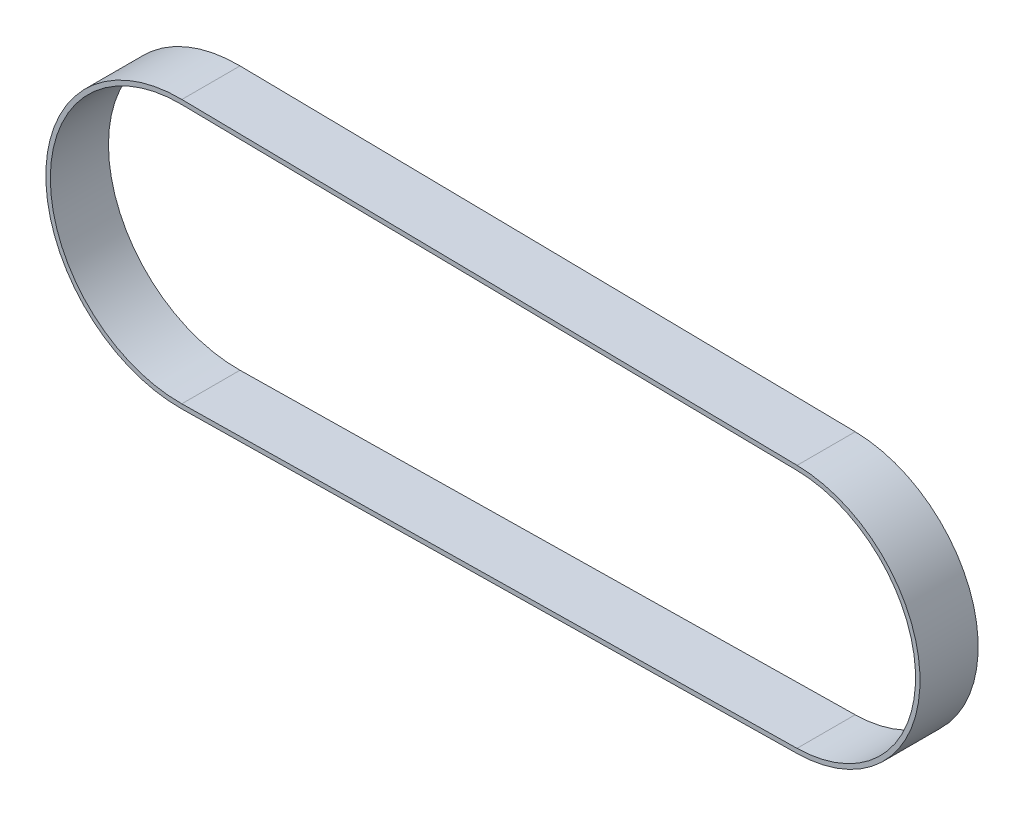
ISO-10303-21;
HEADER;
FILE_DESCRIPTION(('STEP AP214'),'2;1');
FILE_NAME('part.step','',(''),(''),'','','');
FILE_SCHEMA(('AUTOMOTIVE_DESIGN { 1 0 10303 214 1 1 1 1 }'));
ENDSEC;
DATA;
#1=APPLICATION_CONTEXT('core data for automotive mechanical design processes');
#2=APPLICATION_PROTOCOL_DEFINITION('international standard','automotive_design',2000,#1);
#3=PRODUCT_CONTEXT('',#1,'mechanical');
#4=PRODUCT('Part','Part','',(#3));
#5=PRODUCT_RELATED_PRODUCT_CATEGORY('part','',(#4));
#6=PRODUCT_DEFINITION_FORMATION('','',#4);
#7=PRODUCT_DEFINITION_CONTEXT('part definition',#1,'design');
#8=PRODUCT_DEFINITION('design','',#6,#7);
#9=PRODUCT_DEFINITION_SHAPE('','',#8);
#10=(LENGTH_UNIT() NAMED_UNIT(*) SI_UNIT(.MILLI.,.METRE.));
#11=(NAMED_UNIT(*) PLANE_ANGLE_UNIT() SI_UNIT($,.RADIAN.));
#12=(NAMED_UNIT(*) SI_UNIT($,.STERADIAN.) SOLID_ANGLE_UNIT());
#13=UNCERTAINTY_MEASURE_WITH_UNIT(LENGTH_MEASURE(1.E-05),#10,'distance_accuracy_value','');
#14=(GEOMETRIC_REPRESENTATION_CONTEXT(3) GLOBAL_UNCERTAINTY_ASSIGNED_CONTEXT((#13)) GLOBAL_UNIT_ASSIGNED_CONTEXT((#10,
#11,#12)) REPRESENTATION_CONTEXT('',''));
#15=CARTESIAN_POINT('',(0.,0.,0.));
#16=DIRECTION('',(0.,0.,1.));
#17=DIRECTION('',(1.,0.,0.));
#18=AXIS2_PLACEMENT_3D('',#15,#16,#17);
#19=CARTESIAN_POINT('',(-158.727259161453,0.,15.));
#20=DIRECTION('',(0.,0.,-1.));
#21=DIRECTION('',(-1.,0.,0.));
#22=AXIS2_PLACEMENT_3D('',#19,#20,#21);
#23=CYLINDRICAL_SURFACE('',#22,34.578163);
#24=CARTESIAN_POINT('',(-158.727259161453,0.,0.));
#25=DIRECTION('',(0.,0.,-1.));
#26=DIRECTION('',(-1.,0.,0.));
#27=AXIS2_PLACEMENT_3D('',#24,#25,#26);
#28=CIRCLE('',#27,34.578163);
#29=CARTESIAN_POINT('',(-158.207986742925,34.5742637320005,0.));
#30=VERTEX_POINT('',#29);
#31=CARTESIAN_POINT('',(-158.207986742925,-34.5742637320005,0.));
#32=VERTEX_POINT('',#31);
#33=EDGE_CURVE('E102',#30,#32,#28,.F.);
#34=ORIENTED_EDGE('',*,*,#33,.T.);
#35=DIRECTION('',(0.,0.,1.));
#36=VECTOR('',#35,1.);
#37=CARTESIAN_POINT('',(-158.207986742925,-34.5742637320005,15.));
#38=LINE('',#37,#36);
#39=CARTESIAN_POINT('',(-158.207986742925,-34.5742637320005,15.));
#40=VERTEX_POINT('',#39);
#41=EDGE_CURVE('E117',#32,#40,#38,.T.);
#42=ORIENTED_EDGE('',*,*,#41,.T.);
#43=CARTESIAN_POINT('',(-158.727259161453,0.,15.));
#44=DIRECTION('',(0.,0.,-1.));
#45=DIRECTION('',(-1.,0.,0.));
#46=AXIS2_PLACEMENT_3D('',#43,#44,#45);
#47=CIRCLE('',#46,34.578163);
#48=CARTESIAN_POINT('',(-158.207986742925,34.5742637320005,15.));
#49=VERTEX_POINT('',#48);
#50=EDGE_CURVE('E130',#49,#40,#47,.F.);
#51=ORIENTED_EDGE('',*,*,#50,.F.);
#52=DIRECTION('',(0.,0.,1.));
#53=VECTOR('',#52,1.);
#54=CARTESIAN_POINT('',(-158.207986742925,34.5742637320005,15.));
#55=LINE('',#54,#53);
#56=EDGE_CURVE('E98',#49,#30,#55,.F.);
#57=ORIENTED_EDGE('',*,*,#56,.T.);
#58=EDGE_LOOP('',(#34,#42,#51,#57));
#59=FACE_BOUND('',#58,.T.);
#60=ADVANCED_FACE('F17',(#59),#23,.T.);
#61=CARTESIAN_POINT('',(-158.207986742925,-34.5742637320005,15.));
#62=DIRECTION('',(-0.0150173512262025,0.999887233222902,0.));
#63=DIRECTION('',(-0.999887233222902,-0.0150173512262025,0.));
#64=AXIS2_PLACEMENT_3D('',#61,#62,#63);
#65=PLANE('',#64);
#66=DIRECTION('',(0.,0.,-1.));
#67=VECTOR('',#66,1.);
#68=CARTESIAN_POINT('',(0.483476114051973,-32.1908695299947,15.));
#69=LINE('',#68,#67);
#70=CARTESIAN_POINT('',(0.483476114051963,-32.1908695299947,15.));
#71=VERTEX_POINT('',#70);
#72=CARTESIAN_POINT('',(0.483476114051976,-32.1908695299947,0.));
#73=VERTEX_POINT('',#72);
#74=EDGE_CURVE('E84',#71,#73,#69,.T.);
#75=ORIENTED_EDGE('',*,*,#74,.F.);
#76=DIRECTION('',(0.999887233222901,0.0150173512262026,0.));
#77=VECTOR('',#76,1.);
#78=CARTESIAN_POINT('',(-158.207986742925,-34.5742637320005,15.));
#79=LINE('',#78,#77);
#80=EDGE_CURVE('E129',#40,#71,#79,.T.);
#81=ORIENTED_EDGE('',*,*,#80,.F.);
#82=ORIENTED_EDGE('',*,*,#41,.F.);
#83=DIRECTION('',(0.999887233222901,0.0150173512262026,0.));
#84=VECTOR('',#83,1.);
#85=CARTESIAN_POINT('',(-158.207986742925,-34.5742637320005,0.));
#86=LINE('',#85,#84);
#87=EDGE_CURVE('E89',#32,#73,#86,.T.);
#88=ORIENTED_EDGE('',*,*,#87,.T.);
#89=EDGE_LOOP('',(#75,#81,#82,#88));
#90=FACE_BOUND('',#89,.T.);
#91=ADVANCED_FACE('F180',(#90),#65,.F.);
#92=CARTESIAN_POINT('',(0.,0.,15.));
#93=DIRECTION('',(0.,0.,-1.));
#94=DIRECTION('',(-1.,0.,0.));
#95=AXIS2_PLACEMENT_3D('',#92,#93,#94);
#96=CYLINDRICAL_SURFACE('',#95,32.1945);
#97=CARTESIAN_POINT('',(0.,0.,15.));
#98=DIRECTION('',(0.,0.,-1.));
#99=DIRECTION('',(-1.,0.,0.));
#100=AXIS2_PLACEMENT_3D('',#97,#98,#99);
#101=CIRCLE('',#100,32.1945);
#102=CARTESIAN_POINT('',(0.483476114052001,32.1908695299947,15.));
#103=VERTEX_POINT('',#102);
#104=EDGE_CURVE('E127',#71,#103,#101,.F.);
#105=ORIENTED_EDGE('',*,*,#104,.F.);
#106=ORIENTED_EDGE('',*,*,#74,.T.);
#107=CARTESIAN_POINT('',(0.,0.,0.));
#108=DIRECTION('',(0.,0.,-1.));
#109=DIRECTION('',(-1.,0.,0.));
#110=AXIS2_PLACEMENT_3D('',#107,#108,#109);
#111=CIRCLE('',#110,32.1945);
#112=CARTESIAN_POINT('',(0.483476114052001,32.1908695299947,0.));
#113=VERTEX_POINT('',#112);
#114=EDGE_CURVE('E20',#73,#113,#111,.F.);
#115=ORIENTED_EDGE('',*,*,#114,.T.);
#116=DIRECTION('',(0.,0.,1.));
#117=VECTOR('',#116,1.);
#118=CARTESIAN_POINT('',(0.483476114052028,32.1908695299947,15.));
#119=LINE('',#118,#117);
#120=EDGE_CURVE('E82',#113,#103,#119,.T.);
#121=ORIENTED_EDGE('',*,*,#120,.T.);
#122=EDGE_LOOP('',(#105,#106,#115,#121));
#123=FACE_BOUND('',#122,.T.);
#124=ADVANCED_FACE('F81',(#123),#96,.T.);
#125=CARTESIAN_POINT('',(-158.207986742925,34.5742637320005,15.));
#126=DIRECTION('',(-0.0150173512262024,-0.999887233222902,0.));
#127=DIRECTION('',(0.999887233222902,-0.0150173512262024,0.));
#128=AXIS2_PLACEMENT_3D('',#125,#126,#127);
#129=PLANE('',#128);
#130=ORIENTED_EDGE('',*,*,#56,.F.);
#131=DIRECTION('',(-0.999887233222901,0.0150173512262024,0.));
#132=VECTOR('',#131,1.);
#133=CARTESIAN_POINT('',(0.483476114052001,32.1908695299947,15.));
#134=LINE('',#133,#132);
#135=EDGE_CURVE('E96',#103,#49,#134,.T.);
#136=ORIENTED_EDGE('',*,*,#135,.F.);
#137=ORIENTED_EDGE('',*,*,#120,.F.);
#138=DIRECTION('',(-0.999887233222901,0.0150173512262024,0.));
#139=VECTOR('',#138,1.);
#140=CARTESIAN_POINT('',(0.483476114052001,32.1908695299947,0.));
#141=LINE('',#140,#139);
#142=EDGE_CURVE('E88',#113,#30,#141,.T.);
#143=ORIENTED_EDGE('',*,*,#142,.T.);
#144=EDGE_LOOP('',(#130,#136,#137,#143));
#145=FACE_BOUND('',#144,.T.);
#146=ADVANCED_FACE('F93',(#145),#129,.F.);
#147=CARTESIAN_POINT('',(-158.225342295738,-33.4186940565648,15.));
#148=DIRECTION('',(-0.0150173512262025,0.999887233222902,0.));
#149=DIRECTION('',(-0.999887233222902,-0.0150173512262025,0.));
#150=AXIS2_PLACEMENT_3D('',#147,#148,#149);
#151=PLANE('',#150);
#152=DIRECTION('',(-0.999887233222901,-0.0150173512262025,0.));
#153=VECTOR('',#152,1.);
#154=CARTESIAN_POINT('',(0.466120561239847,-31.035299854559,15.));
#155=LINE('',#154,#153);
#156=CARTESIAN_POINT('',(0.466120561239853,-31.035299854559,15.));
#157=VERTEX_POINT('',#156);
#158=CARTESIAN_POINT('',(-158.225342295738,-33.4186940565648,15.));
#159=VERTEX_POINT('',#158);
#160=EDGE_CURVE('E123',#157,#159,#155,.T.);
#161=ORIENTED_EDGE('',*,*,#160,.F.);
#162=DIRECTION('',(0.,0.,-1.));
#163=VECTOR('',#162,1.);
#164=CARTESIAN_POINT('',(0.466120561239851,-31.035299854559,15.));
#165=LINE('',#164,#163);
#166=CARTESIAN_POINT('',(0.466120561239853,-31.035299854559,0.));
#167=VERTEX_POINT('',#166);
#168=EDGE_CURVE('E112',#157,#167,#165,.T.);
#169=ORIENTED_EDGE('',*,*,#168,.T.);
#170=DIRECTION('',(-0.999887233222901,-0.0150173512262025,0.));
#171=VECTOR('',#170,1.);
#172=CARTESIAN_POINT('',(0.466120561239847,-31.035299854559,0.));
#173=LINE('',#172,#171);
#174=CARTESIAN_POINT('',(-158.225342295738,-33.4186940565648,0.));
#175=VERTEX_POINT('',#174);
#176=EDGE_CURVE('E104',#167,#175,#173,.T.);
#177=ORIENTED_EDGE('',*,*,#176,.T.);
#178=DIRECTION('',(0.,0.,-1.));
#179=VECTOR('',#178,1.);
#180=CARTESIAN_POINT('',(-158.225342295738,-33.4186940565648,15.));
#181=LINE('',#180,#179);
#182=EDGE_CURVE('E109',#175,#159,#181,.F.);
#183=ORIENTED_EDGE('',*,*,#182,.T.);
#184=EDGE_LOOP('',(#161,#169,#177,#183));
#185=FACE_BOUND('',#184,.T.);
#186=ADVANCED_FACE('F157',(#185),#151,.T.);
#187=CARTESIAN_POINT('',(-158.727259161453,0.,0.));
#188=DIRECTION('',(0.,0.,1.));
#189=DIRECTION('',(1.,0.,0.));
#190=AXIS2_PLACEMENT_3D('',#187,#188,#189);
#191=PLANE('',#190);
#192=DIRECTION('',(0.999887233222902,-0.0150173512262024,0.));
#193=VECTOR('',#192,1.);
#194=CARTESIAN_POINT('',(-158.225342295738,33.4186940565648,0.));
#195=LINE('',#194,#193);
#196=CARTESIAN_POINT('',(-158.225342295738,33.4186940565648,0.));
#197=VERTEX_POINT('',#196);
#198=CARTESIAN_POINT('',(0.46612056123987,31.035299854559,0.));
#199=VERTEX_POINT('',#198);
#200=EDGE_CURVE('E120',#197,#199,#195,.T.);
#201=ORIENTED_EDGE('',*,*,#200,.F.);
#202=CARTESIAN_POINT('',(-158.727259161453,0.,0.));
#203=DIRECTION('',(0.,0.,-1.));
#204=DIRECTION('',(-1.,0.,0.));
#205=AXIS2_PLACEMENT_3D('',#202,#203,#204);
#206=CIRCLE('',#205,33.422463);
#207=EDGE_CURVE('E121',#197,#175,#206,.F.);
#208=ORIENTED_EDGE('',*,*,#207,.T.);
#209=ORIENTED_EDGE('',*,*,#176,.F.);
#210=CARTESIAN_POINT('',(0.,0.,0.));
#211=DIRECTION('',(0.,0.,-1.));
#212=DIRECTION('',(-1.,0.,0.));
#213=AXIS2_PLACEMENT_3D('',#210,#211,#212);
#214=CIRCLE('',#213,31.0388);
#215=EDGE_CURVE('E113',#167,#199,#214,.F.);
#216=ORIENTED_EDGE('',*,*,#215,.T.);
#217=EDGE_LOOP('',(#201,#208,#209,#216));
#218=FACE_BOUND('',#217,.T.);
#219=ORIENTED_EDGE('',*,*,#142,.F.);
#220=ORIENTED_EDGE('',*,*,#114,.F.);
#221=ORIENTED_EDGE('',*,*,#87,.F.);
#222=ORIENTED_EDGE('',*,*,#33,.F.);
#223=EDGE_LOOP('',(#219,#220,#221,#222));
#224=FACE_BOUND('',#223,.T.);
#225=ADVANCED_FACE('F100',(#218,#224),#191,.F.);
#226=CARTESIAN_POINT('',(0.,0.,15.));
#227=DIRECTION('',(0.,0.,-1.));
#228=DIRECTION('',(-1.,0.,0.));
#229=AXIS2_PLACEMENT_3D('',#226,#227,#228);
#230=CYLINDRICAL_SURFACE('',#229,31.0388);
#231=ORIENTED_EDGE('',*,*,#168,.F.);
#232=CARTESIAN_POINT('',(0.,0.,15.));
#233=DIRECTION('',(0.,0.,-1.));
#234=DIRECTION('',(-1.,0.,0.));
#235=AXIS2_PLACEMENT_3D('',#232,#233,#234);
#236=CIRCLE('',#235,31.0388);
#237=CARTESIAN_POINT('',(0.466120561239854,31.035299854559,15.));
#238=VERTEX_POINT('',#237);
#239=EDGE_CURVE('E124',#238,#157,#236,.T.);
#240=ORIENTED_EDGE('',*,*,#239,.F.);
#241=DIRECTION('',(0.,0.,1.));
#242=VECTOR('',#241,1.);
#243=CARTESIAN_POINT('',(0.466120561239874,31.035299854559,15.));
#244=LINE('',#243,#242);
#245=EDGE_CURVE('E142',#199,#238,#244,.T.);
#246=ORIENTED_EDGE('',*,*,#245,.F.);
#247=ORIENTED_EDGE('',*,*,#215,.F.);
#248=EDGE_LOOP('',(#231,#240,#246,#247));
#249=FACE_BOUND('',#248,.T.);
#250=ADVANCED_FACE('F143',(#249),#230,.F.);
#251=CARTESIAN_POINT('',(-158.727259161453,0.,15.));
#252=DIRECTION('',(0.,0.,1.));
#253=DIRECTION('',(1.,0.,0.));
#254=AXIS2_PLACEMENT_3D('',#251,#252,#253);
#255=PLANE('',#254);
#256=ORIENTED_EDGE('',*,*,#160,.T.);
#257=CARTESIAN_POINT('',(-158.727259161453,0.,15.));
#258=DIRECTION('',(0.,0.,-1.));
#259=DIRECTION('',(-1.,0.,0.));
#260=AXIS2_PLACEMENT_3D('',#257,#258,#259);
#261=CIRCLE('',#260,33.422463);
#262=CARTESIAN_POINT('',(-158.225342295738,33.4186940565648,15.));
#263=VERTEX_POINT('',#262);
#264=EDGE_CURVE('E35',#159,#263,#261,.T.);
#265=ORIENTED_EDGE('',*,*,#264,.T.);
#266=DIRECTION('',(0.999887233222902,-0.0150173512262024,0.));
#267=VECTOR('',#266,1.);
#268=CARTESIAN_POINT('',(-158.225342295738,33.4186940565648,15.));
#269=LINE('',#268,#267);
#270=EDGE_CURVE('E26',#238,#263,#269,.F.);
#271=ORIENTED_EDGE('',*,*,#270,.F.);
#272=ORIENTED_EDGE('',*,*,#239,.T.);
#273=EDGE_LOOP('',(#256,#265,#271,#272));
#274=FACE_BOUND('',#273,.T.);
#275=ORIENTED_EDGE('',*,*,#104,.T.);
#276=ORIENTED_EDGE('',*,*,#135,.T.);
#277=ORIENTED_EDGE('',*,*,#50,.T.);
#278=ORIENTED_EDGE('',*,*,#80,.T.);
#279=EDGE_LOOP('',(#275,#276,#277,#278));
#280=FACE_BOUND('',#279,.T.);
#281=ADVANCED_FACE('F154',(#274,#280),#255,.T.);
#282=CARTESIAN_POINT('',(-158.727259161453,0.,15.));
#283=DIRECTION('',(0.,0.,-1.));
#284=DIRECTION('',(-1.,0.,0.));
#285=AXIS2_PLACEMENT_3D('',#282,#283,#284);
#286=CYLINDRICAL_SURFACE('',#285,33.422463);
#287=ORIENTED_EDGE('',*,*,#264,.F.);
#288=ORIENTED_EDGE('',*,*,#182,.F.);
#289=ORIENTED_EDGE('',*,*,#207,.F.);
#290=DIRECTION('',(0.,0.,1.));
#291=VECTOR('',#290,1.);
#292=CARTESIAN_POINT('',(-158.225342295738,33.4186940565648,15.));
#293=LINE('',#292,#291);
#294=EDGE_CURVE('E11',#263,#197,#293,.F.);
#295=ORIENTED_EDGE('',*,*,#294,.F.);
#296=EDGE_LOOP('',(#287,#288,#289,#295));
#297=FACE_BOUND('',#296,.T.);
#298=ADVANCED_FACE('F160',(#297),#286,.F.);
#299=CARTESIAN_POINT('',(-158.225342295738,33.4186940565648,15.));
#300=DIRECTION('',(-0.0150173512262024,-0.999887233222902,0.));
#301=DIRECTION('',(0.999887233222902,-0.0150173512262024,0.));
#302=AXIS2_PLACEMENT_3D('',#299,#300,#301);
#303=PLANE('',#302);
#304=ORIENTED_EDGE('',*,*,#270,.T.);
#305=ORIENTED_EDGE('',*,*,#294,.T.);
#306=ORIENTED_EDGE('',*,*,#200,.T.);
#307=ORIENTED_EDGE('',*,*,#245,.T.);
#308=EDGE_LOOP('',(#304,#305,#306,#307));
#309=FACE_BOUND('',#308,.T.);
#310=ADVANCED_FACE('F147',(#309),#303,.T.);
#311=CLOSED_SHELL('',(#60,#91,#124,#146,#186,#225,#250,#281,#298,#310));
#312=MANIFOLD_SOLID_BREP('B1',#311);
#313=ADVANCED_BREP_SHAPE_REPRESENTATION('',(#18,#312),#14);
#314=SHAPE_DEFINITION_REPRESENTATION(#9,#313);
ENDSEC;
END-ISO-10303-21;
